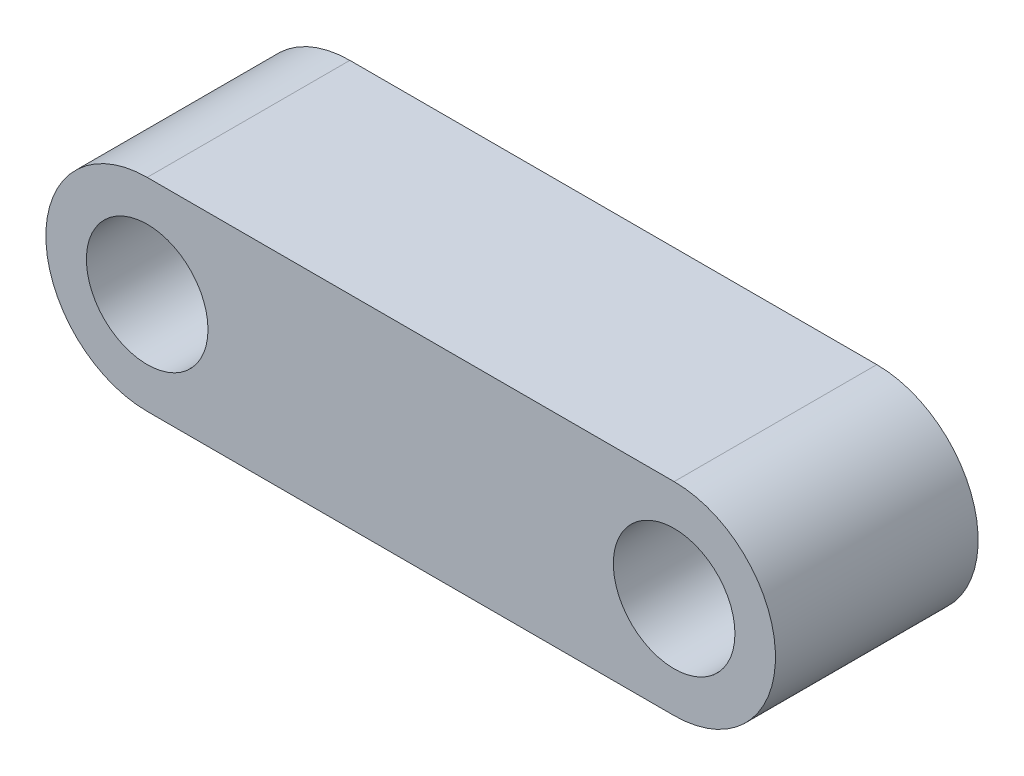
ISO-10303-21;
HEADER;
FILE_DESCRIPTION(('STEP AP214'),'2;1');
FILE_NAME('part.step','',(''),(''),'','','');
FILE_SCHEMA(('AUTOMOTIVE_DESIGN { 1 0 10303 214 1 1 1 1 }'));
ENDSEC;
DATA;
#1=APPLICATION_CONTEXT('core data for automotive mechanical design processes');
#2=APPLICATION_PROTOCOL_DEFINITION('international standard','automotive_design',2000,#1);
#3=PRODUCT_CONTEXT('',#1,'mechanical');
#4=PRODUCT('Part','Part','',(#3));
#5=PRODUCT_RELATED_PRODUCT_CATEGORY('part','',(#4));
#6=PRODUCT_DEFINITION_FORMATION('','',#4);
#7=PRODUCT_DEFINITION_CONTEXT('part definition',#1,'design');
#8=PRODUCT_DEFINITION('design','',#6,#7);
#9=PRODUCT_DEFINITION_SHAPE('','',#8);
#10=(LENGTH_UNIT() NAMED_UNIT(*) SI_UNIT(.MILLI.,.METRE.));
#11=(NAMED_UNIT(*) PLANE_ANGLE_UNIT() SI_UNIT($,.RADIAN.));
#12=(NAMED_UNIT(*) SI_UNIT($,.STERADIAN.) SOLID_ANGLE_UNIT());
#13=UNCERTAINTY_MEASURE_WITH_UNIT(LENGTH_MEASURE(1.E-05),#10,'distance_accuracy_value','');
#14=(GEOMETRIC_REPRESENTATION_CONTEXT(3) GLOBAL_UNCERTAINTY_ASSIGNED_CONTEXT((#13)) GLOBAL_UNIT_ASSIGNED_CONTEXT((#10,
#11,#12)) REPRESENTATION_CONTEXT('',''));
#15=CARTESIAN_POINT('',(0.,0.,0.));
#16=DIRECTION('',(0.,0.,1.));
#17=DIRECTION('',(1.,0.,0.));
#18=AXIS2_PLACEMENT_3D('',#15,#16,#17);
#19=CARTESIAN_POINT('',(-6.5,0.,2.5));
#20=DIRECTION('',(0.,0.,1.));
#21=DIRECTION('',(1.,0.,0.));
#22=AXIS2_PLACEMENT_3D('',#19,#20,#21);
#23=PLANE('',#22);
#24=CARTESIAN_POINT('',(-6.5,0.,2.5));
#25=DIRECTION('',(0.,0.,1.));
#26=DIRECTION('',(1.,0.,0.));
#27=AXIS2_PLACEMENT_3D('',#24,#25,#26);
#28=CIRCLE('',#27,1.5);
#29=CARTESIAN_POINT('',(-5.,0.,2.5));
#30=VERTEX_POINT('',#29);
#31=EDGE_CURVE('E102',#30,#30,#28,.T.);
#32=ORIENTED_EDGE('',*,*,#31,.F.);
#33=EDGE_LOOP('',(#32));
#34=FACE_BOUND('',#33,.T.);
#35=CARTESIAN_POINT('',(-6.5,0.,2.5));
#36=DIRECTION('',(0.,0.,1.));
#37=DIRECTION('',(1.,0.,0.));
#38=AXIS2_PLACEMENT_3D('',#35,#36,#37);
#39=CIRCLE('',#38,2.5);
#40=CARTESIAN_POINT('',(-6.5,2.5,2.5));
#41=VERTEX_POINT('',#40);
#42=CARTESIAN_POINT('',(-6.5,-2.5,2.5));
#43=VERTEX_POINT('',#42);
#44=EDGE_CURVE('E87',#41,#43,#39,.T.);
#45=ORIENTED_EDGE('',*,*,#44,.T.);
#46=DIRECTION('',(1.,0.,0.));
#47=VECTOR('',#46,1.);
#48=CARTESIAN_POINT('',(-6.5,-2.5,2.5));
#49=LINE('',#48,#47);
#50=CARTESIAN_POINT('',(6.5,-2.5,2.5));
#51=VERTEX_POINT('',#50);
#52=EDGE_CURVE('E82',#43,#51,#49,.T.);
#53=ORIENTED_EDGE('',*,*,#52,.T.);
#54=CARTESIAN_POINT('',(6.5,0.,2.5));
#55=DIRECTION('',(0.,0.,1.));
#56=DIRECTION('',(1.,0.,0.));
#57=AXIS2_PLACEMENT_3D('',#54,#55,#56);
#58=CIRCLE('',#57,2.5);
#59=CARTESIAN_POINT('',(6.5,2.5,2.5));
#60=VERTEX_POINT('',#59);
#61=EDGE_CURVE('E85',#51,#60,#58,.T.);
#62=ORIENTED_EDGE('',*,*,#61,.T.);
#63=DIRECTION('',(-1.,0.,0.));
#64=VECTOR('',#63,1.);
#65=CARTESIAN_POINT('',(-6.5,2.5,2.5));
#66=LINE('',#65,#64);
#67=EDGE_CURVE('E52',#60,#41,#66,.T.);
#68=ORIENTED_EDGE('',*,*,#67,.T.);
#69=EDGE_LOOP('',(#45,#53,#62,#68));
#70=FACE_BOUND('',#69,.T.);
#71=CARTESIAN_POINT('',(6.5,0.,2.5));
#72=DIRECTION('',(0.,0.,1.));
#73=DIRECTION('',(1.,0.,0.));
#74=AXIS2_PLACEMENT_3D('',#71,#72,#73);
#75=CIRCLE('',#74,1.5);
#76=CARTESIAN_POINT('',(8.,0.,2.5));
#77=VERTEX_POINT('',#76);
#78=EDGE_CURVE('E117',#77,#77,#75,.T.);
#79=ORIENTED_EDGE('',*,*,#78,.F.);
#80=EDGE_LOOP('',(#79));
#81=FACE_BOUND('',#80,.T.);
#82=ADVANCED_FACE('F35',(#34,#70,#81),#23,.T.);
#83=CARTESIAN_POINT('',(-6.5,0.,-2.5));
#84=DIRECTION('',(0.,0.,1.));
#85=DIRECTION('',(1.,0.,0.));
#86=AXIS2_PLACEMENT_3D('',#83,#84,#85);
#87=PLANE('',#86);
#88=CARTESIAN_POINT('',(-6.5,0.,-2.5));
#89=DIRECTION('',(0.,0.,1.));
#90=DIRECTION('',(1.,0.,0.));
#91=AXIS2_PLACEMENT_3D('',#88,#89,#90);
#92=CIRCLE('',#91,2.5);
#93=CARTESIAN_POINT('',(-6.5,2.5,-2.5));
#94=VERTEX_POINT('',#93);
#95=CARTESIAN_POINT('',(-6.5,-2.5,-2.5));
#96=VERTEX_POINT('',#95);
#97=EDGE_CURVE('E99',#94,#96,#92,.T.);
#98=ORIENTED_EDGE('',*,*,#97,.F.);
#99=DIRECTION('',(-1.,0.,0.));
#100=VECTOR('',#99,1.);
#101=CARTESIAN_POINT('',(-6.5,2.5,-2.5));
#102=LINE('',#101,#100);
#103=CARTESIAN_POINT('',(6.5,2.5,-2.5));
#104=VERTEX_POINT('',#103);
#105=EDGE_CURVE('E75',#104,#94,#102,.T.);
#106=ORIENTED_EDGE('',*,*,#105,.F.);
#107=CARTESIAN_POINT('',(6.5,0.,-2.5));
#108=DIRECTION('',(0.,0.,1.));
#109=DIRECTION('',(1.,0.,0.));
#110=AXIS2_PLACEMENT_3D('',#107,#108,#109);
#111=CIRCLE('',#110,2.5);
#112=CARTESIAN_POINT('',(6.5,-2.5,-2.5));
#113=VERTEX_POINT('',#112);
#114=EDGE_CURVE('E69',#113,#104,#111,.T.);
#115=ORIENTED_EDGE('',*,*,#114,.F.);
#116=DIRECTION('',(1.,0.,0.));
#117=VECTOR('',#116,1.);
#118=CARTESIAN_POINT('',(-6.5,-2.5,-2.5));
#119=LINE('',#118,#117);
#120=EDGE_CURVE('E91',#96,#113,#119,.T.);
#121=ORIENTED_EDGE('',*,*,#120,.F.);
#122=EDGE_LOOP('',(#98,#106,#115,#121));
#123=FACE_BOUND('',#122,.T.);
#124=CARTESIAN_POINT('',(-6.5,0.,-2.5));
#125=DIRECTION('',(0.,0.,1.));
#126=DIRECTION('',(1.,0.,0.));
#127=AXIS2_PLACEMENT_3D('',#124,#125,#126);
#128=CIRCLE('',#127,1.5);
#129=CARTESIAN_POINT('',(-5.,0.,-2.5));
#130=VERTEX_POINT('',#129);
#131=EDGE_CURVE('E114',#130,#130,#128,.T.);
#132=ORIENTED_EDGE('',*,*,#131,.T.);
#133=EDGE_LOOP('',(#132));
#134=FACE_BOUND('',#133,.T.);
#135=CARTESIAN_POINT('',(6.5,0.,-2.5));
#136=DIRECTION('',(0.,0.,1.));
#137=DIRECTION('',(1.,0.,0.));
#138=AXIS2_PLACEMENT_3D('',#135,#136,#137);
#139=CIRCLE('',#138,1.5);
#140=CARTESIAN_POINT('',(8.,0.,-2.5));
#141=VERTEX_POINT('',#140);
#142=EDGE_CURVE('E120',#141,#141,#139,.T.);
#143=ORIENTED_EDGE('',*,*,#142,.T.);
#144=EDGE_LOOP('',(#143));
#145=FACE_BOUND('',#144,.T.);
#146=ADVANCED_FACE('F110',(#123,#134,#145),#87,.F.);
#147=CARTESIAN_POINT('',(-6.5,0.,2.5));
#148=DIRECTION('',(0.,0.,-1.));
#149=DIRECTION('',(-1.,0.,0.));
#150=AXIS2_PLACEMENT_3D('',#147,#148,#149);
#151=CYLINDRICAL_SURFACE('',#150,2.5);
#152=ORIENTED_EDGE('',*,*,#97,.T.);
#153=DIRECTION('',(0.,0.,-1.));
#154=VECTOR('',#153,1.);
#155=CARTESIAN_POINT('',(-6.5,-2.5,2.5));
#156=LINE('',#155,#154);
#157=EDGE_CURVE('E11',#43,#96,#156,.T.);
#158=ORIENTED_EDGE('',*,*,#157,.F.);
#159=ORIENTED_EDGE('',*,*,#44,.F.);
#160=DIRECTION('',(0.,0.,-1.));
#161=VECTOR('',#160,1.);
#162=CARTESIAN_POINT('',(-6.5,2.5,2.5));
#163=LINE('',#162,#161);
#164=EDGE_CURVE('E95',#41,#94,#163,.T.);
#165=ORIENTED_EDGE('',*,*,#164,.T.);
#166=EDGE_LOOP('',(#152,#158,#159,#165));
#167=FACE_BOUND('',#166,.T.);
#168=ADVANCED_FACE('F37',(#167),#151,.T.);
#169=CARTESIAN_POINT('',(-6.5,-2.5,2.5));
#170=DIRECTION('',(0.,1.,0.));
#171=DIRECTION('',(-1.,0.,0.));
#172=AXIS2_PLACEMENT_3D('',#169,#170,#171);
#173=PLANE('',#172);
#174=ORIENTED_EDGE('',*,*,#120,.T.);
#175=DIRECTION('',(0.,0.,-1.));
#176=VECTOR('',#175,1.);
#177=CARTESIAN_POINT('',(6.5,-2.5,2.5));
#178=LINE('',#177,#176);
#179=EDGE_CURVE('E44',#51,#113,#178,.T.);
#180=ORIENTED_EDGE('',*,*,#179,.F.);
#181=ORIENTED_EDGE('',*,*,#52,.F.);
#182=ORIENTED_EDGE('',*,*,#157,.T.);
#183=EDGE_LOOP('',(#174,#180,#181,#182));
#184=FACE_BOUND('',#183,.T.);
#185=ADVANCED_FACE('F90',(#184),#173,.F.);
#186=CARTESIAN_POINT('',(6.5,0.,2.5));
#187=DIRECTION('',(0.,0.,-1.));
#188=DIRECTION('',(-1.,0.,0.));
#189=AXIS2_PLACEMENT_3D('',#186,#187,#188);
#190=CYLINDRICAL_SURFACE('',#189,2.5);
#191=ORIENTED_EDGE('',*,*,#114,.T.);
#192=DIRECTION('',(0.,0.,-1.));
#193=VECTOR('',#192,1.);
#194=CARTESIAN_POINT('',(6.5,2.5,2.5));
#195=LINE('',#194,#193);
#196=EDGE_CURVE('E92',#60,#104,#195,.T.);
#197=ORIENTED_EDGE('',*,*,#196,.F.);
#198=ORIENTED_EDGE('',*,*,#61,.F.);
#199=ORIENTED_EDGE('',*,*,#179,.T.);
#200=EDGE_LOOP('',(#191,#197,#198,#199));
#201=FACE_BOUND('',#200,.T.);
#202=ADVANCED_FACE('F93',(#201),#190,.T.);
#203=CARTESIAN_POINT('',(-6.5,2.5,2.5));
#204=DIRECTION('',(0.,-1.,0.));
#205=DIRECTION('',(1.,0.,0.));
#206=AXIS2_PLACEMENT_3D('',#203,#204,#205);
#207=PLANE('',#206);
#208=ORIENTED_EDGE('',*,*,#105,.T.);
#209=ORIENTED_EDGE('',*,*,#164,.F.);
#210=ORIENTED_EDGE('',*,*,#67,.F.);
#211=ORIENTED_EDGE('',*,*,#196,.T.);
#212=EDGE_LOOP('',(#208,#209,#210,#211));
#213=FACE_BOUND('',#212,.T.);
#214=ADVANCED_FACE('F107',(#213),#207,.F.);
#215=CARTESIAN_POINT('',(-6.5,0.,2.5));
#216=DIRECTION('',(0.,0.,-1.));
#217=DIRECTION('',(-1.,0.,0.));
#218=AXIS2_PLACEMENT_3D('',#215,#216,#217);
#219=CYLINDRICAL_SURFACE('',#218,1.5);
#220=ORIENTED_EDGE('',*,*,#31,.T.);
#221=EDGE_LOOP('',(#220));
#222=FACE_BOUND('',#221,.T.);
#223=ORIENTED_EDGE('',*,*,#131,.F.);
#224=EDGE_LOOP('',(#223));
#225=FACE_BOUND('',#224,.T.);
#226=ADVANCED_FACE('F137',(#222,#225),#219,.F.);
#227=CARTESIAN_POINT('',(6.5,0.,2.5));
#228=DIRECTION('',(0.,0.,-1.));
#229=DIRECTION('',(-1.,0.,0.));
#230=AXIS2_PLACEMENT_3D('',#227,#228,#229);
#231=CYLINDRICAL_SURFACE('',#230,1.5);
#232=ORIENTED_EDGE('',*,*,#78,.T.);
#233=EDGE_LOOP('',(#232));
#234=FACE_BOUND('',#233,.T.);
#235=ORIENTED_EDGE('',*,*,#142,.F.);
#236=EDGE_LOOP('',(#235));
#237=FACE_BOUND('',#236,.T.);
#238=ADVANCED_FACE('F126',(#234,#237),#231,.F.);
#239=CLOSED_SHELL('',(#82,#146,#168,#185,#202,#214,#226,#238));
#240=MANIFOLD_SOLID_BREP('B2',#239);
#241=ADVANCED_BREP_SHAPE_REPRESENTATION('',(#18,#240),#14);
#242=SHAPE_DEFINITION_REPRESENTATION(#9,#241);
ENDSEC;
END-ISO-10303-21;
